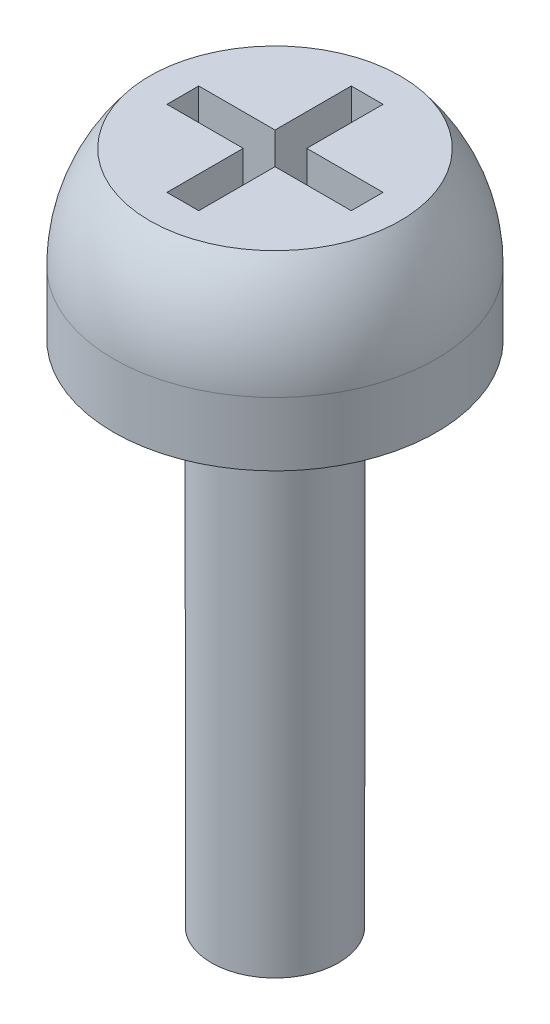
ISO-10303-21;
HEADER;
FILE_DESCRIPTION(('STEP AP214'),'2;1');
FILE_NAME('part.step','',(''),(''),'','','');
FILE_SCHEMA(('AUTOMOTIVE_DESIGN { 1 0 10303 214 1 1 1 1 }'));
ENDSEC;
DATA;
#1=APPLICATION_CONTEXT('core data for automotive mechanical design processes');
#2=APPLICATION_PROTOCOL_DEFINITION('international standard','automotive_design',2000,#1);
#3=PRODUCT_CONTEXT('',#1,'mechanical');
#4=PRODUCT('Part','Part','',(#3));
#5=PRODUCT_RELATED_PRODUCT_CATEGORY('part','',(#4));
#6=PRODUCT_DEFINITION_FORMATION('','',#4);
#7=PRODUCT_DEFINITION_CONTEXT('part definition',#1,'design');
#8=PRODUCT_DEFINITION('design','',#6,#7);
#9=PRODUCT_DEFINITION_SHAPE('','',#8);
#10=(LENGTH_UNIT() NAMED_UNIT(*) SI_UNIT(.MILLI.,.METRE.));
#11=(NAMED_UNIT(*) PLANE_ANGLE_UNIT() SI_UNIT($,.RADIAN.));
#12=(NAMED_UNIT(*) SI_UNIT($,.STERADIAN.) SOLID_ANGLE_UNIT());
#13=UNCERTAINTY_MEASURE_WITH_UNIT(LENGTH_MEASURE(1.E-05),#10,'distance_accuracy_value','');
#14=(GEOMETRIC_REPRESENTATION_CONTEXT(3) GLOBAL_UNCERTAINTY_ASSIGNED_CONTEXT((#13)) GLOBAL_UNIT_ASSIGNED_CONTEXT((#10,
#11,#12)) REPRESENTATION_CONTEXT('',''));
#15=CARTESIAN_POINT('',(0.,0.,0.));
#16=DIRECTION('',(0.,0.,1.));
#17=DIRECTION('',(1.,0.,0.));
#18=AXIS2_PLACEMENT_3D('',#15,#16,#17);
#19=CARTESIAN_POINT('',(0.,1.3,0.));
#20=DIRECTION('',(0.,-1.,0.));
#21=DIRECTION('',(0.,0.,-1.));
#22=AXIS2_PLACEMENT_3D('',#19,#20,#21);
#23=PLANE('',#22);
#24=CARTESIAN_POINT('',(0.,1.3,0.));
#25=DIRECTION('',(0.,-1.,0.));
#26=DIRECTION('',(0.,0.,-1.));
#27=AXIS2_PLACEMENT_3D('',#24,#25,#26);
#28=CIRCLE('',#27,0.986356933366416);
#29=CARTESIAN_POINT('',(0.,1.3,-0.986356933366416));
#30=VERTEX_POINT('',#29);
#31=EDGE_CURVE('E210',#30,#30,#28,.T.);
#32=ORIENTED_EDGE('',*,*,#31,.F.);
#33=EDGE_LOOP('',(#32));
#34=FACE_BOUND('',#33,.T.);
#35=DIRECTION('',(1.,0.,0.));
#36=VECTOR('',#35,1.);
#37=CARTESIAN_POINT('',(-0.125,1.3,-0.725));
#38=LINE('',#37,#36);
#39=CARTESIAN_POINT('',(-0.125,1.3,-0.725));
#40=VERTEX_POINT('',#39);
#41=CARTESIAN_POINT('',(0.125,1.3,-0.725));
#42=VERTEX_POINT('',#41);
#43=EDGE_CURVE('E51',#40,#42,#38,.T.);
#44=ORIENTED_EDGE('',*,*,#43,.T.);
#45=DIRECTION('',(0.,0.,1.));
#46=VECTOR('',#45,1.);
#47=CARTESIAN_POINT('',(0.125,1.3,-0.725));
#48=LINE('',#47,#46);
#49=CARTESIAN_POINT('',(0.125,1.3,-0.125));
#50=VERTEX_POINT('',#49);
#51=EDGE_CURVE('E159',#42,#50,#48,.T.);
#52=ORIENTED_EDGE('',*,*,#51,.T.);
#53=DIRECTION('',(1.,0.,0.));
#54=VECTOR('',#53,1.);
#55=CARTESIAN_POINT('',(0.125,1.3,-0.125));
#56=LINE('',#55,#54);
#57=CARTESIAN_POINT('',(0.725,1.3,-0.125));
#58=VERTEX_POINT('',#57);
#59=EDGE_CURVE('E163',#50,#58,#56,.T.);
#60=ORIENTED_EDGE('',*,*,#59,.T.);
#61=DIRECTION('',(0.,0.,1.));
#62=VECTOR('',#61,1.);
#63=CARTESIAN_POINT('',(0.725,1.3,-0.125));
#64=LINE('',#63,#62);
#65=CARTESIAN_POINT('',(0.725,1.3,0.125));
#66=VERTEX_POINT('',#65);
#67=EDGE_CURVE('E166',#58,#66,#64,.T.);
#68=ORIENTED_EDGE('',*,*,#67,.T.);
#69=DIRECTION('',(-1.,0.,0.));
#70=VECTOR('',#69,1.);
#71=CARTESIAN_POINT('',(0.125,1.3,0.125));
#72=LINE('',#71,#70);
#73=CARTESIAN_POINT('',(0.125,1.3,0.125));
#74=VERTEX_POINT('',#73);
#75=EDGE_CURVE('E169',#66,#74,#72,.T.);
#76=ORIENTED_EDGE('',*,*,#75,.T.);
#77=DIRECTION('',(0.,0.,1.));
#78=VECTOR('',#77,1.);
#79=CARTESIAN_POINT('',(0.125,1.3,0.725));
#80=LINE('',#79,#78);
#81=CARTESIAN_POINT('',(0.125,1.3,0.725));
#82=VERTEX_POINT('',#81);
#83=EDGE_CURVE('E172',#74,#82,#80,.T.);
#84=ORIENTED_EDGE('',*,*,#83,.T.);
#85=DIRECTION('',(-1.,0.,0.));
#86=VECTOR('',#85,1.);
#87=CARTESIAN_POINT('',(-0.125,1.3,0.725));
#88=LINE('',#87,#86);
#89=CARTESIAN_POINT('',(-0.125,1.3,0.725));
#90=VERTEX_POINT('',#89);
#91=EDGE_CURVE('E175',#82,#90,#88,.T.);
#92=ORIENTED_EDGE('',*,*,#91,.T.);
#93=DIRECTION('',(0.,0.,-1.));
#94=VECTOR('',#93,1.);
#95=CARTESIAN_POINT('',(-0.125,1.3,0.725));
#96=LINE('',#95,#94);
#97=CARTESIAN_POINT('',(-0.125,1.3,0.125));
#98=VERTEX_POINT('',#97);
#99=EDGE_CURVE('E178',#90,#98,#96,.T.);
#100=ORIENTED_EDGE('',*,*,#99,.T.);
#101=DIRECTION('',(-1.,0.,0.));
#102=VECTOR('',#101,1.);
#103=CARTESIAN_POINT('',(-0.125,1.3,0.125));
#104=LINE('',#103,#102);
#105=CARTESIAN_POINT('',(-0.725,1.3,0.125));
#106=VERTEX_POINT('',#105);
#107=EDGE_CURVE('E181',#98,#106,#104,.T.);
#108=ORIENTED_EDGE('',*,*,#107,.T.);
#109=DIRECTION('',(0.,0.,-1.));
#110=VECTOR('',#109,1.);
#111=CARTESIAN_POINT('',(-0.725,1.3,-0.125));
#112=LINE('',#111,#110);
#113=CARTESIAN_POINT('',(-0.725,1.3,-0.125));
#114=VERTEX_POINT('',#113);
#115=EDGE_CURVE('E184',#106,#114,#112,.T.);
#116=ORIENTED_EDGE('',*,*,#115,.T.);
#117=DIRECTION('',(1.,0.,0.));
#118=VECTOR('',#117,1.);
#119=CARTESIAN_POINT('',(-0.125,1.3,-0.125));
#120=LINE('',#119,#118);
#121=CARTESIAN_POINT('',(-0.125,1.3,-0.125));
#122=VERTEX_POINT('',#121);
#123=EDGE_CURVE('E149',#114,#122,#120,.T.);
#124=ORIENTED_EDGE('',*,*,#123,.T.);
#125=DIRECTION('',(0.,0.,-1.));
#126=VECTOR('',#125,1.);
#127=CARTESIAN_POINT('',(-0.125,1.3,-0.725));
#128=LINE('',#127,#126);
#129=EDGE_CURVE('E187',#122,#40,#128,.T.);
#130=ORIENTED_EDGE('',*,*,#129,.T.);
#131=EDGE_LOOP('',(#44,#52,#60,#68,#76,#84,#92,#100,#108,#116,#124,#130));
#132=FACE_BOUND('',#131,.T.);
#133=ADVANCED_FACE('F36',(#34,#132),#23,.F.);
#134=CARTESIAN_POINT('',(0.,0.5,0.));
#135=DIRECTION('',(0.,-1.,0.));
#136=DIRECTION('',(0.,0.,-1.));
#137=AXIS2_PLACEMENT_3D('',#134,#135,#136);
#138=CYLINDRICAL_SURFACE('',#137,1.27);
#139=CARTESIAN_POINT('',(0.,0.5,0.));
#140=DIRECTION('',(0.,1.,0.));
#141=DIRECTION('',(0.,0.,1.));
#142=AXIS2_PLACEMENT_3D('',#139,#140,#141);
#143=CIRCLE('',#142,1.27);
#144=CARTESIAN_POINT('',(0.,0.5,1.27));
#145=VERTEX_POINT('',#144);
#146=EDGE_CURVE('E44',#145,#145,#143,.T.);
#147=ORIENTED_EDGE('',*,*,#146,.F.);
#148=EDGE_LOOP('',(#147));
#149=FACE_BOUND('',#148,.T.);
#150=CARTESIAN_POINT('',(0.,0.,0.));
#151=DIRECTION('',(0.,1.,0.));
#152=DIRECTION('',(0.,0.,1.));
#153=AXIS2_PLACEMENT_3D('',#150,#151,#152);
#154=CIRCLE('',#153,1.27);
#155=CARTESIAN_POINT('',(0.,0.,1.27));
#156=VERTEX_POINT('',#155);
#157=EDGE_CURVE('E213',#156,#156,#154,.T.);
#158=ORIENTED_EDGE('',*,*,#157,.T.);
#159=EDGE_LOOP('',(#158));
#160=FACE_BOUND('',#159,.T.);
#161=ADVANCED_FACE('F38',(#149,#160),#138,.T.);
#162=CARTESIAN_POINT('',(0.,0.,0.));
#163=DIRECTION('',(0.,1.,0.));
#164=DIRECTION('',(0.,0.,1.));
#165=AXIS2_PLACEMENT_3D('',#162,#163,#164);
#166=PLANE('',#165);
#167=CARTESIAN_POINT('',(0.,0.,0.));
#168=DIRECTION('',(0.,1.,0.));
#169=DIRECTION('',(0.,0.,1.));
#170=AXIS2_PLACEMENT_3D('',#167,#168,#169);
#171=CIRCLE('',#170,0.5);
#172=CARTESIAN_POINT('',(0.,0.,0.5));
#173=VERTEX_POINT('',#172);
#174=EDGE_CURVE('E11',#173,#173,#171,.F.);
#175=ORIENTED_EDGE('',*,*,#174,.F.);
#176=EDGE_LOOP('',(#175));
#177=FACE_BOUND('',#176,.T.);
#178=ORIENTED_EDGE('',*,*,#157,.F.);
#179=EDGE_LOOP('',(#178));
#180=FACE_BOUND('',#179,.T.);
#181=ADVANCED_FACE('F288',(#177,#180),#166,.F.);
#182=CARTESIAN_POINT('',(0.,0.5,0.));
#183=DIRECTION('',(0.,0.,1.));
#184=DIRECTION('',(-1.,0.,0.));
#185=AXIS2_PLACEMENT_3D('',#182,#183,#184);
#186=SPHERICAL_SURFACE('',#185,1.27);
#187=CARTESIAN_POINT('',(0.,0.5,0.));
#188=DIRECTION('',(0.,-1.,0.));
#189=DIRECTION('',(0.,0.,-1.));
#190=AXIS2_PLACEMENT_3D('',#187,#188,#189);
#191=SPHERICAL_SURFACE('',#190,1.27);
#192=ORIENTED_EDGE('',*,*,#31,.T.);
#193=EDGE_LOOP('',(#192));
#194=FACE_BOUND('',#193,.T.);
#195=ORIENTED_EDGE('',*,*,#146,.T.);
#196=EDGE_LOOP('',(#195));
#197=FACE_BOUND('',#196,.T.);
#198=ADVANCED_FACE('F218',(#194,#197),#191,.T.);
#199=CARTESIAN_POINT('',(-0.125,0.284,-0.725));
#200=DIRECTION('',(0.,0.,1.));
#201=DIRECTION('',(1.,0.,0.));
#202=AXIS2_PLACEMENT_3D('',#199,#200,#201);
#203=PLANE('',#202);
#204=ORIENTED_EDGE('',*,*,#43,.F.);
#205=DIRECTION('',(0.,1.,0.));
#206=VECTOR('',#205,1.);
#207=CARTESIAN_POINT('',(-0.125,0.284,-0.725));
#208=LINE('',#207,#206);
#209=CARTESIAN_POINT('',(-0.125,0.284,-0.725));
#210=VERTEX_POINT('',#209);
#211=EDGE_CURVE('E154',#210,#40,#208,.T.);
#212=ORIENTED_EDGE('',*,*,#211,.F.);
#213=DIRECTION('',(1.,0.,0.));
#214=VECTOR('',#213,1.);
#215=CARTESIAN_POINT('',(-0.125,0.284,-0.725));
#216=LINE('',#215,#214);
#217=CARTESIAN_POINT('',(0.125,0.284,-0.725));
#218=VERTEX_POINT('',#217);
#219=EDGE_CURVE('E190',#210,#218,#216,.T.);
#220=ORIENTED_EDGE('',*,*,#219,.T.);
#221=DIRECTION('',(0.,1.,0.));
#222=VECTOR('',#221,1.);
#223=CARTESIAN_POINT('',(0.125,0.284,-0.725));
#224=LINE('',#223,#222);
#225=EDGE_CURVE('E208',#218,#42,#224,.T.);
#226=ORIENTED_EDGE('',*,*,#225,.T.);
#227=EDGE_LOOP('',(#204,#212,#220,#226));
#228=FACE_BOUND('',#227,.T.);
#229=ADVANCED_FACE('F225',(#228),#203,.T.);
#230=CARTESIAN_POINT('',(0.125,0.284,-0.725));
#231=DIRECTION('',(-1.,0.,0.));
#232=DIRECTION('',(0.,0.,1.));
#233=AXIS2_PLACEMENT_3D('',#230,#231,#232);
#234=PLANE('',#233);
#235=ORIENTED_EDGE('',*,*,#51,.F.);
#236=ORIENTED_EDGE('',*,*,#225,.F.);
#237=DIRECTION('',(0.,0.,1.));
#238=VECTOR('',#237,1.);
#239=CARTESIAN_POINT('',(0.125,0.284,-0.725));
#240=LINE('',#239,#238);
#241=CARTESIAN_POINT('',(0.125,0.284,-0.125));
#242=VERTEX_POINT('',#241);
#243=EDGE_CURVE('E108',#218,#242,#240,.T.);
#244=ORIENTED_EDGE('',*,*,#243,.T.);
#245=DIRECTION('',(0.,1.,0.));
#246=VECTOR('',#245,1.);
#247=CARTESIAN_POINT('',(0.125,0.284,-0.125));
#248=LINE('',#247,#246);
#249=EDGE_CURVE('E206',#242,#50,#248,.T.);
#250=ORIENTED_EDGE('',*,*,#249,.T.);
#251=EDGE_LOOP('',(#235,#236,#244,#250));
#252=FACE_BOUND('',#251,.T.);
#253=ADVANCED_FACE('F276',(#252),#234,.T.);
#254=CARTESIAN_POINT('',(0.125,0.284,-0.125));
#255=DIRECTION('',(0.,0.,1.));
#256=DIRECTION('',(1.,0.,0.));
#257=AXIS2_PLACEMENT_3D('',#254,#255,#256);
#258=PLANE('',#257);
#259=ORIENTED_EDGE('',*,*,#59,.F.);
#260=ORIENTED_EDGE('',*,*,#249,.F.);
#261=DIRECTION('',(1.,0.,0.));
#262=VECTOR('',#261,1.);
#263=CARTESIAN_POINT('',(0.125,0.284,-0.125));
#264=LINE('',#263,#262);
#265=CARTESIAN_POINT('',(0.725,0.284,-0.125));
#266=VERTEX_POINT('',#265);
#267=EDGE_CURVE('E228',#242,#266,#264,.T.);
#268=ORIENTED_EDGE('',*,*,#267,.T.);
#269=DIRECTION('',(0.,1.,0.));
#270=VECTOR('',#269,1.);
#271=CARTESIAN_POINT('',(0.725,0.284,-0.125));
#272=LINE('',#271,#270);
#273=EDGE_CURVE('E204',#266,#58,#272,.T.);
#274=ORIENTED_EDGE('',*,*,#273,.T.);
#275=EDGE_LOOP('',(#259,#260,#268,#274));
#276=FACE_BOUND('',#275,.T.);
#277=ADVANCED_FACE('F273',(#276),#258,.T.);
#278=CARTESIAN_POINT('',(0.725,0.284,-0.125));
#279=DIRECTION('',(-1.,0.,0.));
#280=DIRECTION('',(0.,0.,1.));
#281=AXIS2_PLACEMENT_3D('',#278,#279,#280);
#282=PLANE('',#281);
#283=ORIENTED_EDGE('',*,*,#67,.F.);
#284=ORIENTED_EDGE('',*,*,#273,.F.);
#285=DIRECTION('',(0.,0.,1.));
#286=VECTOR('',#285,1.);
#287=CARTESIAN_POINT('',(0.725,0.284,-0.125));
#288=LINE('',#287,#286);
#289=CARTESIAN_POINT('',(0.725,0.284,0.125));
#290=VERTEX_POINT('',#289);
#291=EDGE_CURVE('E233',#266,#290,#288,.T.);
#292=ORIENTED_EDGE('',*,*,#291,.T.);
#293=DIRECTION('',(0.,1.,0.));
#294=VECTOR('',#293,1.);
#295=CARTESIAN_POINT('',(0.725,0.284,0.125));
#296=LINE('',#295,#294);
#297=EDGE_CURVE('E202',#290,#66,#296,.T.);
#298=ORIENTED_EDGE('',*,*,#297,.T.);
#299=EDGE_LOOP('',(#283,#284,#292,#298));
#300=FACE_BOUND('',#299,.T.);
#301=ADVANCED_FACE('F269',(#300),#282,.T.);
#302=CARTESIAN_POINT('',(0.125,0.284,0.125));
#303=DIRECTION('',(0.,0.,-1.));
#304=DIRECTION('',(-1.,0.,0.));
#305=AXIS2_PLACEMENT_3D('',#302,#303,#304);
#306=PLANE('',#305);
#307=ORIENTED_EDGE('',*,*,#75,.F.);
#308=ORIENTED_EDGE('',*,*,#297,.F.);
#309=DIRECTION('',(-1.,0.,0.));
#310=VECTOR('',#309,1.);
#311=CARTESIAN_POINT('',(0.125,0.284,0.125));
#312=LINE('',#311,#310);
#313=CARTESIAN_POINT('',(0.125,0.284,0.125));
#314=VERTEX_POINT('',#313);
#315=EDGE_CURVE('E235',#290,#314,#312,.T.);
#316=ORIENTED_EDGE('',*,*,#315,.T.);
#317=DIRECTION('',(0.,1.,0.));
#318=VECTOR('',#317,1.);
#319=CARTESIAN_POINT('',(0.125,0.284,0.125));
#320=LINE('',#319,#318);
#321=EDGE_CURVE('E200',#314,#74,#320,.T.);
#322=ORIENTED_EDGE('',*,*,#321,.T.);
#323=EDGE_LOOP('',(#307,#308,#316,#322));
#324=FACE_BOUND('',#323,.T.);
#325=ADVANCED_FACE('F266',(#324),#306,.T.);
#326=CARTESIAN_POINT('',(0.125,0.284,0.725));
#327=DIRECTION('',(-1.,0.,0.));
#328=DIRECTION('',(0.,0.,1.));
#329=AXIS2_PLACEMENT_3D('',#326,#327,#328);
#330=PLANE('',#329);
#331=ORIENTED_EDGE('',*,*,#83,.F.);
#332=ORIENTED_EDGE('',*,*,#321,.F.);
#333=DIRECTION('',(0.,0.,1.));
#334=VECTOR('',#333,1.);
#335=CARTESIAN_POINT('',(0.125,0.284,0.725));
#336=LINE('',#335,#334);
#337=CARTESIAN_POINT('',(0.125,0.284,0.725));
#338=VERTEX_POINT('',#337);
#339=EDGE_CURVE('E237',#314,#338,#336,.T.);
#340=ORIENTED_EDGE('',*,*,#339,.T.);
#341=DIRECTION('',(0.,1.,0.));
#342=VECTOR('',#341,1.);
#343=CARTESIAN_POINT('',(0.125,0.284,0.725));
#344=LINE('',#343,#342);
#345=EDGE_CURVE('E198',#338,#82,#344,.T.);
#346=ORIENTED_EDGE('',*,*,#345,.T.);
#347=EDGE_LOOP('',(#331,#332,#340,#346));
#348=FACE_BOUND('',#347,.T.);
#349=ADVANCED_FACE('F259',(#348),#330,.T.);
#350=CARTESIAN_POINT('',(-0.125,0.284,0.725));
#351=DIRECTION('',(0.,0.,-1.));
#352=DIRECTION('',(-1.,0.,0.));
#353=AXIS2_PLACEMENT_3D('',#350,#351,#352);
#354=PLANE('',#353);
#355=ORIENTED_EDGE('',*,*,#91,.F.);
#356=ORIENTED_EDGE('',*,*,#345,.F.);
#357=DIRECTION('',(-1.,0.,0.));
#358=VECTOR('',#357,1.);
#359=CARTESIAN_POINT('',(-0.125,0.284,0.725));
#360=LINE('',#359,#358);
#361=CARTESIAN_POINT('',(-0.125,0.284,0.725));
#362=VERTEX_POINT('',#361);
#363=EDGE_CURVE('E239',#338,#362,#360,.T.);
#364=ORIENTED_EDGE('',*,*,#363,.T.);
#365=DIRECTION('',(0.,1.,0.));
#366=VECTOR('',#365,1.);
#367=CARTESIAN_POINT('',(-0.125,0.284,0.725));
#368=LINE('',#367,#366);
#369=EDGE_CURVE('E196',#362,#90,#368,.T.);
#370=ORIENTED_EDGE('',*,*,#369,.T.);
#371=EDGE_LOOP('',(#355,#356,#364,#370));
#372=FACE_BOUND('',#371,.T.);
#373=ADVANCED_FACE('F255',(#372),#354,.T.);
#374=CARTESIAN_POINT('',(-0.125,0.284,0.725));
#375=DIRECTION('',(1.,0.,0.));
#376=DIRECTION('',(0.,0.,-1.));
#377=AXIS2_PLACEMENT_3D('',#374,#375,#376);
#378=PLANE('',#377);
#379=ORIENTED_EDGE('',*,*,#99,.F.);
#380=ORIENTED_EDGE('',*,*,#369,.F.);
#381=DIRECTION('',(0.,0.,-1.));
#382=VECTOR('',#381,1.);
#383=CARTESIAN_POINT('',(-0.125,0.284,0.725));
#384=LINE('',#383,#382);
#385=CARTESIAN_POINT('',(-0.125,0.284,0.125));
#386=VERTEX_POINT('',#385);
#387=EDGE_CURVE('E241',#362,#386,#384,.T.);
#388=ORIENTED_EDGE('',*,*,#387,.T.);
#389=DIRECTION('',(0.,1.,0.));
#390=VECTOR('',#389,1.);
#391=CARTESIAN_POINT('',(-0.125,0.284,0.125));
#392=LINE('',#391,#390);
#393=EDGE_CURVE('E194',#386,#98,#392,.T.);
#394=ORIENTED_EDGE('',*,*,#393,.T.);
#395=EDGE_LOOP('',(#379,#380,#388,#394));
#396=FACE_BOUND('',#395,.T.);
#397=ADVANCED_FACE('F252',(#396),#378,.T.);
#398=CARTESIAN_POINT('',(-0.125,0.284,0.125));
#399=DIRECTION('',(0.,0.,-1.));
#400=DIRECTION('',(-1.,0.,0.));
#401=AXIS2_PLACEMENT_3D('',#398,#399,#400);
#402=PLANE('',#401);
#403=ORIENTED_EDGE('',*,*,#107,.F.);
#404=ORIENTED_EDGE('',*,*,#393,.F.);
#405=DIRECTION('',(-1.,0.,0.));
#406=VECTOR('',#405,1.);
#407=CARTESIAN_POINT('',(-0.125,0.284,0.125));
#408=LINE('',#407,#406);
#409=CARTESIAN_POINT('',(-0.725,0.284,0.125));
#410=VERTEX_POINT('',#409);
#411=EDGE_CURVE('E145',#386,#410,#408,.T.);
#412=ORIENTED_EDGE('',*,*,#411,.T.);
#413=DIRECTION('',(0.,1.,0.));
#414=VECTOR('',#413,1.);
#415=CARTESIAN_POINT('',(-0.725,0.284,0.125));
#416=LINE('',#415,#414);
#417=EDGE_CURVE('E141',#410,#106,#416,.T.);
#418=ORIENTED_EDGE('',*,*,#417,.T.);
#419=EDGE_LOOP('',(#403,#404,#412,#418));
#420=FACE_BOUND('',#419,.T.);
#421=ADVANCED_FACE('F245',(#420),#402,.T.);
#422=CARTESIAN_POINT('',(-0.725,0.284,-0.125));
#423=DIRECTION('',(1.,0.,0.));
#424=DIRECTION('',(0.,0.,-1.));
#425=AXIS2_PLACEMENT_3D('',#422,#423,#424);
#426=PLANE('',#425);
#427=ORIENTED_EDGE('',*,*,#115,.F.);
#428=ORIENTED_EDGE('',*,*,#417,.F.);
#429=DIRECTION('',(0.,0.,-1.));
#430=VECTOR('',#429,1.);
#431=CARTESIAN_POINT('',(-0.725,0.284,-0.125));
#432=LINE('',#431,#430);
#433=CARTESIAN_POINT('',(-0.725,0.284,-0.125));
#434=VERTEX_POINT('',#433);
#435=EDGE_CURVE('E136',#410,#434,#432,.T.);
#436=ORIENTED_EDGE('',*,*,#435,.T.);
#437=DIRECTION('',(0.,1.,0.));
#438=VECTOR('',#437,1.);
#439=CARTESIAN_POINT('',(-0.725,0.284,-0.125));
#440=LINE('',#439,#438);
#441=EDGE_CURVE('E140',#434,#114,#440,.T.);
#442=ORIENTED_EDGE('',*,*,#441,.T.);
#443=EDGE_LOOP('',(#427,#428,#436,#442));
#444=FACE_BOUND('',#443,.T.);
#445=ADVANCED_FACE('F139',(#444),#426,.T.);
#446=CARTESIAN_POINT('',(-0.125,0.284,-0.125));
#447=DIRECTION('',(0.,0.,1.));
#448=DIRECTION('',(1.,0.,0.));
#449=AXIS2_PLACEMENT_3D('',#446,#447,#448);
#450=PLANE('',#449);
#451=ORIENTED_EDGE('',*,*,#123,.F.);
#452=ORIENTED_EDGE('',*,*,#441,.F.);
#453=DIRECTION('',(1.,0.,0.));
#454=VECTOR('',#453,1.);
#455=CARTESIAN_POINT('',(-0.125,0.284,-0.125));
#456=LINE('',#455,#454);
#457=CARTESIAN_POINT('',(-0.125,0.284,-0.125));
#458=VERTEX_POINT('',#457);
#459=EDGE_CURVE('E144',#434,#458,#456,.T.);
#460=ORIENTED_EDGE('',*,*,#459,.T.);
#461=DIRECTION('',(0.,1.,0.));
#462=VECTOR('',#461,1.);
#463=CARTESIAN_POINT('',(-0.125,0.284,-0.125));
#464=LINE('',#463,#462);
#465=EDGE_CURVE('E99',#458,#122,#464,.T.);
#466=ORIENTED_EDGE('',*,*,#465,.T.);
#467=EDGE_LOOP('',(#451,#452,#460,#466));
#468=FACE_BOUND('',#467,.T.);
#469=ADVANCED_FACE('F147',(#468),#450,.T.);
#470=CARTESIAN_POINT('',(-0.125,0.284,-0.725));
#471=DIRECTION('',(1.,0.,0.));
#472=DIRECTION('',(0.,0.,-1.));
#473=AXIS2_PLACEMENT_3D('',#470,#471,#472);
#474=PLANE('',#473);
#475=ORIENTED_EDGE('',*,*,#129,.F.);
#476=ORIENTED_EDGE('',*,*,#465,.F.);
#477=DIRECTION('',(0.,0.,-1.));
#478=VECTOR('',#477,1.);
#479=CARTESIAN_POINT('',(-0.125,0.284,-0.725));
#480=LINE('',#479,#478);
#481=EDGE_CURVE('E59',#458,#210,#480,.T.);
#482=ORIENTED_EDGE('',*,*,#481,.T.);
#483=ORIENTED_EDGE('',*,*,#211,.T.);
#484=EDGE_LOOP('',(#475,#476,#482,#483));
#485=FACE_BOUND('',#484,.T.);
#486=ADVANCED_FACE('F224',(#485),#474,.T.);
#487=CARTESIAN_POINT('',(0.,0.284,0.));
#488=DIRECTION('',(0.,-1.,0.));
#489=DIRECTION('',(0.,0.,-1.));
#490=AXIS2_PLACEMENT_3D('',#487,#488,#489);
#491=PLANE('',#490);
#492=ORIENTED_EDGE('',*,*,#219,.F.);
#493=ORIENTED_EDGE('',*,*,#481,.F.);
#494=ORIENTED_EDGE('',*,*,#459,.F.);
#495=ORIENTED_EDGE('',*,*,#435,.F.);
#496=ORIENTED_EDGE('',*,*,#411,.F.);
#497=ORIENTED_EDGE('',*,*,#387,.F.);
#498=ORIENTED_EDGE('',*,*,#363,.F.);
#499=ORIENTED_EDGE('',*,*,#339,.F.);
#500=ORIENTED_EDGE('',*,*,#315,.F.);
#501=ORIENTED_EDGE('',*,*,#291,.F.);
#502=ORIENTED_EDGE('',*,*,#267,.F.);
#503=ORIENTED_EDGE('',*,*,#243,.F.);
#504=EDGE_LOOP('',(#492,#493,#494,#495,#496,#497,#498,#499,#500,#501,#502,#503));
#505=FACE_BOUND('',#504,.T.);
#506=ADVANCED_FACE('F152',(#505),#491,.F.);
#507=CARTESIAN_POINT('',(0.,-4.,0.));
#508=DIRECTION('',(0.,1.,0.));
#509=DIRECTION('',(0.,0.,1.));
#510=AXIS2_PLACEMENT_3D('',#507,#508,#509);
#511=CYLINDRICAL_SURFACE('',#510,0.5);
#512=CARTESIAN_POINT('',(0.,-4.,0.));
#513=DIRECTION('',(0.,-1.,0.));
#514=DIRECTION('',(0.,0.,-1.));
#515=AXIS2_PLACEMENT_3D('',#512,#513,#514);
#516=CIRCLE('',#515,0.5);
#517=CARTESIAN_POINT('',(0.,-4.,-0.5));
#518=VERTEX_POINT('',#517);
#519=EDGE_CURVE('E160',#518,#518,#516,.T.);
#520=ORIENTED_EDGE('',*,*,#519,.F.);
#521=EDGE_LOOP('',(#520));
#522=FACE_BOUND('',#521,.T.);
#523=ORIENTED_EDGE('',*,*,#174,.T.);
#524=EDGE_LOOP('',(#523));
#525=FACE_BOUND('',#524,.T.);
#526=ADVANCED_FACE('F300',(#522,#525),#511,.T.);
#527=CARTESIAN_POINT('',(0.,-4.,0.));
#528=DIRECTION('',(0.,-1.,0.));
#529=DIRECTION('',(0.,0.,-1.));
#530=AXIS2_PLACEMENT_3D('',#527,#528,#529);
#531=PLANE('',#530);
#532=ORIENTED_EDGE('',*,*,#519,.T.);
#533=EDGE_LOOP('',(#532));
#534=FACE_BOUND('',#533,.T.);
#535=ADVANCED_FACE('F302',(#534),#531,.T.);
#536=CLOSED_SHELL('',(#133,#161,#181,#198,#229,#253,#277,#301,#325,#349,#373,#397,#421,#445,
#469,#486,#506,#526,#535));
#537=MANIFOLD_SOLID_BREP('B2',#536);
#538=ADVANCED_BREP_SHAPE_REPRESENTATION('',(#18,#537),#14);
#539=SHAPE_DEFINITION_REPRESENTATION(#9,#538);
ENDSEC;
END-ISO-10303-21;
